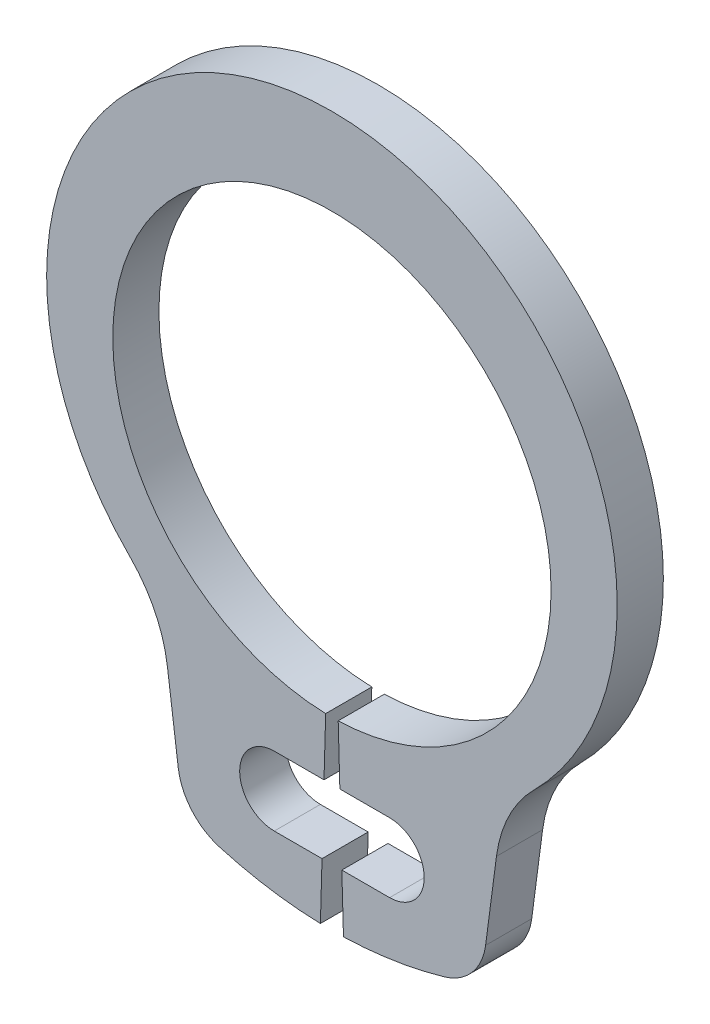
ISO-10303-21;
HEADER;
FILE_DESCRIPTION(('STEP AP214'),'2;1');
FILE_NAME('part.step','',(''),(''),'','','');
FILE_SCHEMA(('AUTOMOTIVE_DESIGN { 1 0 10303 214 1 1 1 1 }'));
ENDSEC;
DATA;
#1=APPLICATION_CONTEXT('core data for automotive mechanical design processes');
#2=APPLICATION_PROTOCOL_DEFINITION('international standard','automotive_design',2000,#1);
#3=PRODUCT_CONTEXT('',#1,'mechanical');
#4=PRODUCT('Part','Part','',(#3));
#5=PRODUCT_RELATED_PRODUCT_CATEGORY('part','',(#4));
#6=PRODUCT_DEFINITION_FORMATION('','',#4);
#7=PRODUCT_DEFINITION_CONTEXT('part definition',#1,'design');
#8=PRODUCT_DEFINITION('design','',#6,#7);
#9=PRODUCT_DEFINITION_SHAPE('','',#8);
#10=(LENGTH_UNIT() NAMED_UNIT(*) SI_UNIT(.MILLI.,.METRE.));
#11=(NAMED_UNIT(*) PLANE_ANGLE_UNIT() SI_UNIT($,.RADIAN.));
#12=(NAMED_UNIT(*) SI_UNIT($,.STERADIAN.) SOLID_ANGLE_UNIT());
#13=UNCERTAINTY_MEASURE_WITH_UNIT(LENGTH_MEASURE(1.E-05),#10,'distance_accuracy_value','');
#14=(GEOMETRIC_REPRESENTATION_CONTEXT(3) GLOBAL_UNCERTAINTY_ASSIGNED_CONTEXT((#13)) GLOBAL_UNIT_ASSIGNED_CONTEXT((#10,
#11,#12)) REPRESENTATION_CONTEXT('',''));
#15=CARTESIAN_POINT('',(0.,0.,0.));
#16=DIRECTION('',(0.,0.,1.));
#17=DIRECTION('',(1.,0.,0.));
#18=AXIS2_PLACEMENT_3D('',#15,#16,#17);
#19=CARTESIAN_POINT('',(-0.108571428571429,-3.7984486629278,-0.8));
#20=DIRECTION('',(0.999591753402051,-0.0285714285714286,0.));
#21=DIRECTION('',(0.0285714285714286,0.999591753402052,0.));
#22=AXIS2_PLACEMENT_3D('',#19,#20,#21);
#23=PLANE('',#22);
#24=DIRECTION('',(0.,0.,1.));
#25=VECTOR('',#24,1.);
#26=CARTESIAN_POINT('',(-0.13743687708596,-4.80832691319598,-0.8));
#27=LINE('',#26,#25);
#28=CARTESIAN_POINT('',(-0.13743687708596,-4.80832691319598,-0.8));
#29=VERTEX_POINT('',#28);
#30=CARTESIAN_POINT('',(-0.13743687708596,-4.80832691319598,0.));
#31=VERTEX_POINT('',#30);
#32=EDGE_CURVE('E205',#29,#31,#27,.T.);
#33=ORIENTED_EDGE('',*,*,#32,.F.);
#34=DIRECTION('',(0.0285714285714286,0.999591753402052,0.));
#35=VECTOR('',#34,1.);
#36=CARTESIAN_POINT('',(-0.108571428571429,-3.7984486629278,-0.8));
#37=LINE('',#36,#35);
#38=CARTESIAN_POINT('',(-0.108571428571429,-3.7984486629278,-0.8));
#39=VERTEX_POINT('',#38);
#40=EDGE_CURVE('E194',#29,#39,#37,.T.);
#41=ORIENTED_EDGE('',*,*,#40,.T.);
#42=DIRECTION('',(0.,0.,1.));
#43=VECTOR('',#42,1.);
#44=CARTESIAN_POINT('',(-0.108571428571429,-3.7984486629278,-0.8));
#45=LINE('',#44,#43);
#46=CARTESIAN_POINT('',(-0.108571428571429,-3.7984486629278,0.));
#47=VERTEX_POINT('',#46);
#48=EDGE_CURVE('E11',#39,#47,#45,.T.);
#49=ORIENTED_EDGE('',*,*,#48,.T.);
#50=DIRECTION('',(0.0285714285714286,0.999591753402052,0.));
#51=VECTOR('',#50,1.);
#52=CARTESIAN_POINT('',(-0.108571428571429,-3.7984486629278,0.));
#53=LINE('',#52,#51);
#54=EDGE_CURVE('E283',#31,#47,#53,.T.);
#55=ORIENTED_EDGE('',*,*,#54,.F.);
#56=EDGE_LOOP('',(#33,#41,#49,#55));
#57=FACE_BOUND('',#56,.T.);
#58=ADVANCED_FACE('F34',(#57),#23,.T.);
#59=CARTESIAN_POINT('',(0.108571428571429,-3.7984486629278,-0.8));
#60=DIRECTION('',(-0.999591753402051,-0.0285714285714286,0.));
#61=DIRECTION('',(0.0285714285714286,-0.999591753402052,0.));
#62=AXIS2_PLACEMENT_3D('',#59,#60,#61);
#63=PLANE('',#62);
#64=DIRECTION('',(0.,0.,-1.));
#65=VECTOR('',#64,1.);
#66=CARTESIAN_POINT('',(0.13743687708596,-4.80832691319598,-0.8));
#67=LINE('',#66,#65);
#68=CARTESIAN_POINT('',(0.13743687708596,-4.80832691319598,0.));
#69=VERTEX_POINT('',#68);
#70=CARTESIAN_POINT('',(0.13743687708596,-4.80832691319598,-0.8));
#71=VERTEX_POINT('',#70);
#72=EDGE_CURVE('E316',#69,#71,#67,.T.);
#73=ORIENTED_EDGE('',*,*,#72,.F.);
#74=DIRECTION('',(0.0285714285714286,-0.999591753402052,0.));
#75=VECTOR('',#74,1.);
#76=CARTESIAN_POINT('',(0.108571428571429,-3.7984486629278,0.));
#77=LINE('',#76,#75);
#78=CARTESIAN_POINT('',(0.108571428571429,-3.7984486629278,0.));
#79=VERTEX_POINT('',#78);
#80=EDGE_CURVE('E253',#79,#69,#77,.T.);
#81=ORIENTED_EDGE('',*,*,#80,.F.);
#82=DIRECTION('',(0.,0.,1.));
#83=VECTOR('',#82,1.);
#84=CARTESIAN_POINT('',(0.108571428571429,-3.7984486629278,-0.8));
#85=LINE('',#84,#83);
#86=CARTESIAN_POINT('',(0.108571428571429,-3.7984486629278,-0.8));
#87=VERTEX_POINT('',#86);
#88=EDGE_CURVE('E38',#87,#79,#85,.T.);
#89=ORIENTED_EDGE('',*,*,#88,.F.);
#90=DIRECTION('',(0.0285714285714286,-0.999591753402052,0.));
#91=VECTOR('',#90,1.);
#92=CARTESIAN_POINT('',(0.108571428571429,-3.7984486629278,-0.8));
#93=LINE('',#92,#91);
#94=EDGE_CURVE('E217',#87,#71,#93,.T.);
#95=ORIENTED_EDGE('',*,*,#94,.T.);
#96=EDGE_LOOP('',(#73,#81,#89,#95));
#97=FACE_BOUND('',#96,.T.);
#98=ADVANCED_FACE('F315',(#97),#63,.T.);
#99=CARTESIAN_POINT('',(0.,0.,-0.8));
#100=DIRECTION('',(0.,0.,1.));
#101=DIRECTION('',(1.,0.,0.));
#102=AXIS2_PLACEMENT_3D('',#99,#100,#101);
#103=CYLINDRICAL_SURFACE('',#102,3.8);
#104=CARTESIAN_POINT('',(0.,0.,0.));
#105=DIRECTION('',(0.,0.,-1.));
#106=DIRECTION('',(1.,0.,0.));
#107=AXIS2_PLACEMENT_3D('',#104,#105,#106);
#108=CIRCLE('',#107,3.8);
#109=EDGE_CURVE('E210',#47,#79,#108,.T.);
#110=ORIENTED_EDGE('',*,*,#109,.F.);
#111=ORIENTED_EDGE('',*,*,#48,.F.);
#112=CARTESIAN_POINT('',(0.,0.,-0.8));
#113=DIRECTION('',(0.,0.,-1.));
#114=DIRECTION('',(1.,0.,0.));
#115=AXIS2_PLACEMENT_3D('',#112,#113,#114);
#116=CIRCLE('',#115,3.8);
#117=EDGE_CURVE('E212',#39,#87,#116,.T.);
#118=ORIENTED_EDGE('',*,*,#117,.T.);
#119=ORIENTED_EDGE('',*,*,#88,.T.);
#120=EDGE_LOOP('',(#110,#111,#118,#119));
#121=FACE_BOUND('',#120,.T.);
#122=ADVANCED_FACE('F36',(#121),#103,.F.);
#123=DIRECTION('',(0.,0.,-1.));
#124=VECTOR('',#123,1.);
#125=CARTESIAN_POINT('',(-0.171736594114461,-6.00832691319598,-0.8));
#126=LINE('',#125,#124);
#127=CARTESIAN_POINT('',(-0.171736594114461,-6.00832691319598,0.));
#128=VERTEX_POINT('',#127);
#129=CARTESIAN_POINT('',(-0.171736594114461,-6.00832691319598,-0.8));
#130=VERTEX_POINT('',#129);
#131=EDGE_CURVE('E337',#128,#130,#126,.T.);
#132=ORIENTED_EDGE('',*,*,#131,.F.);
#133=CARTESIAN_POINT('',(-0.2,-6.99714227381436,0.));
#134=VERTEX_POINT('',#133);
#135=EDGE_CURVE('E216',#134,#128,#53,.T.);
#136=ORIENTED_EDGE('',*,*,#135,.F.);
#137=DIRECTION('',(0.,0.,1.));
#138=VECTOR('',#137,1.);
#139=CARTESIAN_POINT('',(-0.2,-6.99714227381436,-0.8));
#140=LINE('',#139,#138);
#141=CARTESIAN_POINT('',(-0.2,-6.99714227381436,-0.8));
#142=VERTEX_POINT('',#141);
#143=EDGE_CURVE('E43',#142,#134,#140,.T.);
#144=ORIENTED_EDGE('',*,*,#143,.F.);
#145=EDGE_CURVE('E247',#142,#130,#37,.T.);
#146=ORIENTED_EDGE('',*,*,#145,.T.);
#147=EDGE_LOOP('',(#132,#136,#144,#146));
#148=FACE_BOUND('',#147,.T.);
#149=ADVANCED_FACE('F385',(#148),#23,.T.);
#150=CARTESIAN_POINT('',(0.,0.,-0.8));
#151=DIRECTION('',(0.,0.,1.));
#152=DIRECTION('',(1.,0.,0.));
#153=AXIS2_PLACEMENT_3D('',#150,#151,#152);
#154=CYLINDRICAL_SURFACE('',#153,7.);
#155=CARTESIAN_POINT('',(0.,0.,0.));
#156=DIRECTION('',(0.,0.,1.));
#157=DIRECTION('',(1.,0.,0.));
#158=AXIS2_PLACEMENT_3D('',#155,#156,#157);
#159=CIRCLE('',#158,7.);
#160=CARTESIAN_POINT('',(-1.95199270347282,-6.72233028685655,0.));
#161=VERTEX_POINT('',#160);
#162=EDGE_CURVE('E280',#161,#134,#159,.T.);
#163=ORIENTED_EDGE('',*,*,#162,.F.);
#164=DIRECTION('',(0.,0.,1.));
#165=VECTOR('',#164,1.);
#166=CARTESIAN_POINT('',(-1.95199270347282,-6.72233028685655,-0.8));
#167=LINE('',#166,#165);
#168=CARTESIAN_POINT('',(-1.95199270347282,-6.72233028685655,-0.8));
#169=VERTEX_POINT('',#168);
#170=EDGE_CURVE('E287',#169,#161,#167,.T.);
#171=ORIENTED_EDGE('',*,*,#170,.F.);
#172=CARTESIAN_POINT('',(0.,0.,-0.8));
#173=DIRECTION('',(0.,0.,1.));
#174=DIRECTION('',(1.,0.,0.));
#175=AXIS2_PLACEMENT_3D('',#172,#173,#174);
#176=CIRCLE('',#175,7.);
#177=EDGE_CURVE('E244',#169,#142,#176,.T.);
#178=ORIENTED_EDGE('',*,*,#177,.T.);
#179=ORIENTED_EDGE('',*,*,#143,.T.);
#180=EDGE_LOOP('',(#163,#171,#178,#179));
#181=FACE_BOUND('',#180,.T.);
#182=ADVANCED_FACE('F381',(#181),#154,.T.);
#183=CARTESIAN_POINT('',(-1.6731366029767,-5.76199738873419,-0.8));
#184=DIRECTION('',(0.,0.,1.));
#185=DIRECTION('',(1.,0.,0.));
#186=AXIS2_PLACEMENT_3D('',#183,#184,#185);
#187=CYLINDRICAL_SURFACE('',#186,1.);
#188=CARTESIAN_POINT('',(-1.6731366029767,-5.76199738873419,0.));
#189=DIRECTION('',(0.,0.,1.));
#190=DIRECTION('',(1.,0.,0.));
#191=AXIS2_PLACEMENT_3D('',#188,#189,#190);
#192=CIRCLE('',#191,1.);
#193=CARTESIAN_POINT('',(-2.66458146435051,-5.89252358095424,0.));
#194=VERTEX_POINT('',#193);
#195=EDGE_CURVE('E277',#194,#161,#192,.T.);
#196=ORIENTED_EDGE('',*,*,#195,.F.);
#197=DIRECTION('',(0.,0.,1.));
#198=VECTOR('',#197,1.);
#199=CARTESIAN_POINT('',(-2.66458146435051,-5.89252358095424,-0.8));
#200=LINE('',#199,#198);
#201=CARTESIAN_POINT('',(-2.66458146435051,-5.89252358095424,-0.8));
#202=VERTEX_POINT('',#201);
#203=EDGE_CURVE('E289',#202,#194,#200,.T.);
#204=ORIENTED_EDGE('',*,*,#203,.F.);
#205=CARTESIAN_POINT('',(-1.6731366029767,-5.76199738873419,-0.8));
#206=DIRECTION('',(0.,0.,1.));
#207=DIRECTION('',(1.,0.,0.));
#208=AXIS2_PLACEMENT_3D('',#205,#206,#207);
#209=CIRCLE('',#208,1.);
#210=EDGE_CURVE('E241',#202,#169,#209,.T.);
#211=ORIENTED_EDGE('',*,*,#210,.T.);
#212=ORIENTED_EDGE('',*,*,#170,.T.);
#213=EDGE_LOOP('',(#196,#204,#211,#212));
#214=FACE_BOUND('',#213,.T.);
#215=ADVANCED_FACE('F377',(#214),#187,.T.);
#216=CARTESIAN_POINT('',(-2.85298125232632,-4.46148511660048,-0.8));
#217=DIRECTION('',(-0.99144486137381,-0.130526192220052,0.));
#218=DIRECTION('',(0.130526192220052,-0.991444861373811,0.));
#219=AXIS2_PLACEMENT_3D('',#216,#217,#218);
#220=PLANE('',#219);
#221=DIRECTION('',(0.130526192220052,-0.99144486137381,0.));
#222=VECTOR('',#221,1.);
#223=CARTESIAN_POINT('',(-2.85298125232632,-4.46148511660048,0.));
#224=LINE('',#223,#222);
#225=CARTESIAN_POINT('',(-2.85298125232632,-4.46148511660048,0.));
#226=VERTEX_POINT('',#225);
#227=EDGE_CURVE('E274',#226,#194,#224,.T.);
#228=ORIENTED_EDGE('',*,*,#227,.F.);
#229=DIRECTION('',(0.,0.,1.));
#230=VECTOR('',#229,1.);
#231=CARTESIAN_POINT('',(-2.85298125232632,-4.46148511660048,-0.8));
#232=LINE('',#231,#230);
#233=CARTESIAN_POINT('',(-2.85298125232632,-4.46148511660048,-0.8));
#234=VERTEX_POINT('',#233);
#235=EDGE_CURVE('E291',#234,#226,#232,.T.);
#236=ORIENTED_EDGE('',*,*,#235,.F.);
#237=DIRECTION('',(0.130526192220052,-0.99144486137381,0.));
#238=VECTOR('',#237,1.);
#239=CARTESIAN_POINT('',(-2.85298125232632,-4.46148511660048,-0.8));
#240=LINE('',#239,#238);
#241=EDGE_CURVE('E238',#234,#202,#240,.T.);
#242=ORIENTED_EDGE('',*,*,#241,.T.);
#243=ORIENTED_EDGE('',*,*,#203,.T.);
#244=EDGE_LOOP('',(#228,#236,#242,#243));
#245=FACE_BOUND('',#244,.T.);
#246=ADVANCED_FACE('F372',(#245),#220,.T.);
#247=CARTESIAN_POINT('',(-5.13117241134197,-4.76141467266642,-0.8));
#248=DIRECTION('',(0.,0.,1.));
#249=DIRECTION('',(1.,0.,0.));
#250=AXIS2_PLACEMENT_3D('',#247,#248,#249);
#251=CYLINDRICAL_SURFACE('',#250,2.29784958072085);
#252=CARTESIAN_POINT('',(-5.13117241134197,-4.76141467266642,0.));
#253=DIRECTION('',(0.,0.,-1.));
#254=DIRECTION('',(1.,0.,0.));
#255=AXIS2_PLACEMENT_3D('',#252,#253,#254);
#256=CIRCLE('',#255,2.29784958072085);
#257=CARTESIAN_POINT('',(-3.5037027583481,-3.13923859584769,0.));
#258=VERTEX_POINT('',#257);
#259=EDGE_CURVE('E271',#258,#226,#256,.T.);
#260=ORIENTED_EDGE('',*,*,#259,.F.);
#261=DIRECTION('',(0.,0.,1.));
#262=VECTOR('',#261,1.);
#263=CARTESIAN_POINT('',(-3.5037027583481,-3.13923859584769,-0.8));
#264=LINE('',#263,#262);
#265=CARTESIAN_POINT('',(-3.5037027583481,-3.13923859584769,-0.8));
#266=VERTEX_POINT('',#265);
#267=EDGE_CURVE('E293',#266,#258,#264,.T.);
#268=ORIENTED_EDGE('',*,*,#267,.F.);
#269=CARTESIAN_POINT('',(-5.13117241134197,-4.76141467266642,-0.8));
#270=DIRECTION('',(0.,0.,-1.));
#271=DIRECTION('',(1.,0.,0.));
#272=AXIS2_PLACEMENT_3D('',#269,#270,#271);
#273=CIRCLE('',#272,2.29784958072085);
#274=EDGE_CURVE('E235',#266,#234,#273,.T.);
#275=ORIENTED_EDGE('',*,*,#274,.T.);
#276=ORIENTED_EDGE('',*,*,#235,.T.);
#277=EDGE_LOOP('',(#260,#268,#275,#276));
#278=FACE_BOUND('',#277,.T.);
#279=ADVANCED_FACE('F368',(#278),#251,.F.);
#280=CARTESIAN_POINT('',(0.,0.35306787169261,-0.8));
#281=DIRECTION('',(0.,0.,1.));
#282=DIRECTION('',(1.,0.,0.));
#283=AXIS2_PLACEMENT_3D('',#280,#281,#282);
#284=CYLINDRICAL_SURFACE('',#283,4.94693212830739);
#285=CARTESIAN_POINT('',(0.,0.35306787169261,0.));
#286=DIRECTION('',(0.,0.,1.));
#287=DIRECTION('',(1.,0.,0.));
#288=AXIS2_PLACEMENT_3D('',#285,#286,#287);
#289=CIRCLE('',#288,4.94693212830739);
#290=CARTESIAN_POINT('',(3.5037027583481,-3.13923859584769,0.));
#291=VERTEX_POINT('',#290);
#292=EDGE_CURVE('E268',#291,#258,#289,.T.);
#293=ORIENTED_EDGE('',*,*,#292,.F.);
#294=DIRECTION('',(0.,0.,1.));
#295=VECTOR('',#294,1.);
#296=CARTESIAN_POINT('',(3.5037027583481,-3.13923859584769,-0.8));
#297=LINE('',#296,#295);
#298=CARTESIAN_POINT('',(3.5037027583481,-3.13923859584769,-0.8));
#299=VERTEX_POINT('',#298);
#300=EDGE_CURVE('E295',#299,#291,#297,.T.);
#301=ORIENTED_EDGE('',*,*,#300,.F.);
#302=CARTESIAN_POINT('',(0.,0.35306787169261,-0.8));
#303=DIRECTION('',(0.,0.,1.));
#304=DIRECTION('',(1.,0.,0.));
#305=AXIS2_PLACEMENT_3D('',#302,#303,#304);
#306=CIRCLE('',#305,4.94693212830739);
#307=EDGE_CURVE('E232',#299,#266,#306,.T.);
#308=ORIENTED_EDGE('',*,*,#307,.T.);
#309=ORIENTED_EDGE('',*,*,#267,.T.);
#310=EDGE_LOOP('',(#293,#301,#308,#309));
#311=FACE_BOUND('',#310,.T.);
#312=ADVANCED_FACE('F364',(#311),#284,.T.);
#313=CARTESIAN_POINT('',(5.13117241134197,-4.76141467266642,-0.8));
#314=DIRECTION('',(0.,0.,1.));
#315=DIRECTION('',(1.,0.,0.));
#316=AXIS2_PLACEMENT_3D('',#313,#314,#315);
#317=CYLINDRICAL_SURFACE('',#316,2.29784958072085);
#318=CARTESIAN_POINT('',(5.13117241134197,-4.76141467266642,0.));
#319=DIRECTION('',(0.,0.,-1.));
#320=DIRECTION('',(1.,0.,0.));
#321=AXIS2_PLACEMENT_3D('',#318,#319,#320);
#322=CIRCLE('',#321,2.29784958072085);
#323=CARTESIAN_POINT('',(2.85298125232632,-4.46148511660048,0.));
#324=VERTEX_POINT('',#323);
#325=EDGE_CURVE('E265',#324,#291,#322,.T.);
#326=ORIENTED_EDGE('',*,*,#325,.F.);
#327=DIRECTION('',(0.,0.,1.));
#328=VECTOR('',#327,1.);
#329=CARTESIAN_POINT('',(2.85298125232632,-4.46148511660048,-0.8));
#330=LINE('',#329,#328);
#331=CARTESIAN_POINT('',(2.85298125232632,-4.46148511660048,-0.8));
#332=VERTEX_POINT('',#331);
#333=EDGE_CURVE('E297',#332,#324,#330,.T.);
#334=ORIENTED_EDGE('',*,*,#333,.F.);
#335=CARTESIAN_POINT('',(5.13117241134197,-4.76141467266642,-0.8));
#336=DIRECTION('',(0.,0.,-1.));
#337=DIRECTION('',(1.,0.,0.));
#338=AXIS2_PLACEMENT_3D('',#335,#336,#337);
#339=CIRCLE('',#338,2.29784958072085);
#340=EDGE_CURVE('E229',#332,#299,#339,.T.);
#341=ORIENTED_EDGE('',*,*,#340,.T.);
#342=ORIENTED_EDGE('',*,*,#300,.T.);
#343=EDGE_LOOP('',(#326,#334,#341,#342));
#344=FACE_BOUND('',#343,.T.);
#345=ADVANCED_FACE('F360',(#344),#317,.F.);
#346=CARTESIAN_POINT('',(2.85298125232632,-4.46148511660048,-0.8));
#347=DIRECTION('',(0.99144486137381,-0.130526192220052,0.));
#348=DIRECTION('',(0.130526192220052,0.991444861373811,0.));
#349=AXIS2_PLACEMENT_3D('',#346,#347,#348);
#350=PLANE('',#349);
#351=DIRECTION('',(0.130526192220052,0.99144486137381,0.));
#352=VECTOR('',#351,1.);
#353=CARTESIAN_POINT('',(2.85298125232632,-4.46148511660048,0.));
#354=LINE('',#353,#352);
#355=CARTESIAN_POINT('',(2.66458146435051,-5.89252358095424,0.));
#356=VERTEX_POINT('',#355);
#357=EDGE_CURVE('E262',#356,#324,#354,.T.);
#358=ORIENTED_EDGE('',*,*,#357,.F.);
#359=DIRECTION('',(0.,0.,1.));
#360=VECTOR('',#359,1.);
#361=CARTESIAN_POINT('',(2.66458146435051,-5.89252358095424,-0.8));
#362=LINE('',#361,#360);
#363=CARTESIAN_POINT('',(2.66458146435051,-5.89252358095424,-0.8));
#364=VERTEX_POINT('',#363);
#365=EDGE_CURVE('E299',#364,#356,#362,.T.);
#366=ORIENTED_EDGE('',*,*,#365,.F.);
#367=DIRECTION('',(0.130526192220052,0.99144486137381,0.));
#368=VECTOR('',#367,1.);
#369=CARTESIAN_POINT('',(2.85298125232632,-4.46148511660048,-0.8));
#370=LINE('',#369,#368);
#371=EDGE_CURVE('E226',#364,#332,#370,.T.);
#372=ORIENTED_EDGE('',*,*,#371,.T.);
#373=ORIENTED_EDGE('',*,*,#333,.T.);
#374=EDGE_LOOP('',(#358,#366,#372,#373));
#375=FACE_BOUND('',#374,.T.);
#376=ADVANCED_FACE('F356',(#375),#350,.T.);
#377=CARTESIAN_POINT('',(1.6731366029767,-5.76199738873419,-0.8));
#378=DIRECTION('',(0.,0.,1.));
#379=DIRECTION('',(1.,0.,0.));
#380=AXIS2_PLACEMENT_3D('',#377,#378,#379);
#381=CYLINDRICAL_SURFACE('',#380,1.);
#382=CARTESIAN_POINT('',(1.6731366029767,-5.76199738873419,0.));
#383=DIRECTION('',(0.,0.,1.));
#384=DIRECTION('',(-1.,0.,0.));
#385=AXIS2_PLACEMENT_3D('',#382,#383,#384);
#386=CIRCLE('',#385,1.);
#387=CARTESIAN_POINT('',(1.95199270347282,-6.72233028685655,0.));
#388=VERTEX_POINT('',#387);
#389=EDGE_CURVE('E259',#388,#356,#386,.T.);
#390=ORIENTED_EDGE('',*,*,#389,.F.);
#391=DIRECTION('',(0.,0.,1.));
#392=VECTOR('',#391,1.);
#393=CARTESIAN_POINT('',(1.95199270347282,-6.72233028685655,-0.8));
#394=LINE('',#393,#392);
#395=CARTESIAN_POINT('',(1.95199270347282,-6.72233028685655,-0.8));
#396=VERTEX_POINT('',#395);
#397=EDGE_CURVE('E301',#396,#388,#394,.T.);
#398=ORIENTED_EDGE('',*,*,#397,.F.);
#399=CARTESIAN_POINT('',(1.6731366029767,-5.76199738873419,-0.8));
#400=DIRECTION('',(0.,0.,1.));
#401=DIRECTION('',(-1.,0.,0.));
#402=AXIS2_PLACEMENT_3D('',#399,#400,#401);
#403=CIRCLE('',#402,1.);
#404=EDGE_CURVE('E223',#396,#364,#403,.T.);
#405=ORIENTED_EDGE('',*,*,#404,.T.);
#406=ORIENTED_EDGE('',*,*,#365,.T.);
#407=EDGE_LOOP('',(#390,#398,#405,#406));
#408=FACE_BOUND('',#407,.T.);
#409=ADVANCED_FACE('F353',(#408),#381,.T.);
#410=CARTESIAN_POINT('',(0.,0.,-0.8));
#411=DIRECTION('',(0.,0.,1.));
#412=DIRECTION('',(1.,0.,0.));
#413=AXIS2_PLACEMENT_3D('',#410,#411,#412);
#414=CYLINDRICAL_SURFACE('',#413,7.);
#415=CARTESIAN_POINT('',(0.,0.,0.));
#416=DIRECTION('',(0.,0.,1.));
#417=DIRECTION('',(1.,0.,0.));
#418=AXIS2_PLACEMENT_3D('',#415,#416,#417);
#419=CIRCLE('',#418,7.);
#420=CARTESIAN_POINT('',(0.199999999999999,-6.99714227381436,0.));
#421=VERTEX_POINT('',#420);
#422=EDGE_CURVE('E256',#421,#388,#419,.T.);
#423=ORIENTED_EDGE('',*,*,#422,.F.);
#424=DIRECTION('',(0.,0.,1.));
#425=VECTOR('',#424,1.);
#426=CARTESIAN_POINT('',(0.199999999999999,-6.99714227381436,-0.8));
#427=LINE('',#426,#425);
#428=CARTESIAN_POINT('',(0.199999999999999,-6.99714227381436,-0.8));
#429=VERTEX_POINT('',#428);
#430=EDGE_CURVE('E302',#429,#421,#427,.T.);
#431=ORIENTED_EDGE('',*,*,#430,.F.);
#432=CARTESIAN_POINT('',(0.,0.,-0.8));
#433=DIRECTION('',(0.,0.,1.));
#434=DIRECTION('',(1.,0.,0.));
#435=AXIS2_PLACEMENT_3D('',#432,#433,#434);
#436=CIRCLE('',#435,7.);
#437=EDGE_CURVE('E220',#429,#396,#436,.T.);
#438=ORIENTED_EDGE('',*,*,#437,.T.);
#439=ORIENTED_EDGE('',*,*,#397,.T.);
#440=EDGE_LOOP('',(#423,#431,#438,#439));
#441=FACE_BOUND('',#440,.T.);
#442=ADVANCED_FACE('F349',(#441),#414,.T.);
#443=DIRECTION('',(0.,0.,1.));
#444=VECTOR('',#443,1.);
#445=CARTESIAN_POINT('',(0.171736594114461,-6.00832691319598,-0.8));
#446=LINE('',#445,#444);
#447=CARTESIAN_POINT('',(0.171736594114461,-6.00832691319598,-0.8));
#448=VERTEX_POINT('',#447);
#449=CARTESIAN_POINT('',(0.171736594114461,-6.00832691319598,0.));
#450=VERTEX_POINT('',#449);
#451=EDGE_CURVE('E332',#448,#450,#446,.T.);
#452=ORIENTED_EDGE('',*,*,#451,.F.);
#453=EDGE_CURVE('E215',#448,#429,#93,.T.);
#454=ORIENTED_EDGE('',*,*,#453,.T.);
#455=ORIENTED_EDGE('',*,*,#430,.T.);
#456=EDGE_CURVE('E252',#450,#421,#77,.T.);
#457=ORIENTED_EDGE('',*,*,#456,.F.);
#458=EDGE_LOOP('',(#452,#454,#455,#457));
#459=FACE_BOUND('',#458,.T.);
#460=ADVANCED_FACE('F347',(#459),#63,.T.);
#461=CARTESIAN_POINT('',(0.,0.,-0.8));
#462=DIRECTION('',(0.,0.,1.));
#463=DIRECTION('',(1.,0.,0.));
#464=AXIS2_PLACEMENT_3D('',#461,#462,#463);
#465=PLANE('',#464);
#466=CARTESIAN_POINT('',(1.,-5.40832691319598,-0.8));
#467=DIRECTION('',(0.,0.,1.));
#468=DIRECTION('',(1.,0.,0.));
#469=AXIS2_PLACEMENT_3D('',#466,#467,#468);
#470=CIRCLE('',#469,0.6);
#471=CARTESIAN_POINT('',(1.,-6.00832691319598,-0.8));
#472=VERTEX_POINT('',#471);
#473=CARTESIAN_POINT('',(1.,-4.80832691319598,-0.8));
#474=VERTEX_POINT('',#473);
#475=EDGE_CURVE('E203',#472,#474,#470,.T.);
#476=ORIENTED_EDGE('',*,*,#475,.T.);
#477=DIRECTION('',(-1.,0.,0.));
#478=VECTOR('',#477,1.);
#479=CARTESIAN_POINT('',(-1.,-4.80832691319598,-0.8));
#480=LINE('',#479,#478);
#481=EDGE_CURVE('E59',#474,#71,#480,.T.);
#482=ORIENTED_EDGE('',*,*,#481,.T.);
#483=ORIENTED_EDGE('',*,*,#94,.F.);
#484=ORIENTED_EDGE('',*,*,#117,.F.);
#485=ORIENTED_EDGE('',*,*,#40,.F.);
#486=CARTESIAN_POINT('',(-1.,-4.80832691319598,-0.8));
#487=VERTEX_POINT('',#486);
#488=EDGE_CURVE('E175',#29,#487,#480,.T.);
#489=ORIENTED_EDGE('',*,*,#488,.T.);
#490=CARTESIAN_POINT('',(-1.,-5.40832691319598,-0.8));
#491=DIRECTION('',(0.,0.,1.));
#492=DIRECTION('',(1.,0.,0.));
#493=AXIS2_PLACEMENT_3D('',#490,#491,#492);
#494=CIRCLE('',#493,0.6);
#495=CARTESIAN_POINT('',(-1.,-6.00832691319598,-0.8));
#496=VERTEX_POINT('',#495);
#497=EDGE_CURVE('E192',#487,#496,#494,.T.);
#498=ORIENTED_EDGE('',*,*,#497,.T.);
#499=DIRECTION('',(1.,0.,0.));
#500=VECTOR('',#499,1.);
#501=CARTESIAN_POINT('',(1.,-6.00832691319598,-0.8));
#502=LINE('',#501,#500);
#503=EDGE_CURVE('E184',#496,#130,#502,.T.);
#504=ORIENTED_EDGE('',*,*,#503,.T.);
#505=ORIENTED_EDGE('',*,*,#145,.F.);
#506=ORIENTED_EDGE('',*,*,#177,.F.);
#507=ORIENTED_EDGE('',*,*,#210,.F.);
#508=ORIENTED_EDGE('',*,*,#241,.F.);
#509=ORIENTED_EDGE('',*,*,#274,.F.);
#510=ORIENTED_EDGE('',*,*,#307,.F.);
#511=ORIENTED_EDGE('',*,*,#340,.F.);
#512=ORIENTED_EDGE('',*,*,#371,.F.);
#513=ORIENTED_EDGE('',*,*,#404,.F.);
#514=ORIENTED_EDGE('',*,*,#437,.F.);
#515=ORIENTED_EDGE('',*,*,#453,.F.);
#516=EDGE_CURVE('E324',#448,#472,#502,.T.);
#517=ORIENTED_EDGE('',*,*,#516,.T.);
#518=EDGE_LOOP('',(#476,#482,#483,#484,#485,#489,#498,#504,#505,#506,#507,#508,#509,#510,#511,
#512,#513,#514,#515,#517));
#519=FACE_BOUND('',#518,.T.);
#520=ADVANCED_FACE('F190',(#519),#465,.F.);
#521=CARTESIAN_POINT('',(0.,0.,0.));
#522=DIRECTION('',(0.,0.,1.));
#523=DIRECTION('',(1.,0.,0.));
#524=AXIS2_PLACEMENT_3D('',#521,#522,#523);
#525=PLANE('',#524);
#526=DIRECTION('',(-1.,0.,0.));
#527=VECTOR('',#526,1.);
#528=CARTESIAN_POINT('',(-1.,-4.80832691319598,0.));
#529=LINE('',#528,#527);
#530=CARTESIAN_POINT('',(1.,-4.80832691319598,0.));
#531=VERTEX_POINT('',#530);
#532=EDGE_CURVE('E327',#531,#69,#529,.T.);
#533=ORIENTED_EDGE('',*,*,#532,.F.);
#534=CARTESIAN_POINT('',(1.,-5.40832691319598,0.));
#535=DIRECTION('',(0.,0.,1.));
#536=DIRECTION('',(1.,0.,0.));
#537=AXIS2_PLACEMENT_3D('',#534,#535,#536);
#538=CIRCLE('',#537,0.6);
#539=CARTESIAN_POINT('',(1.,-6.00832691319598,0.));
#540=VERTEX_POINT('',#539);
#541=EDGE_CURVE('E199',#540,#531,#538,.T.);
#542=ORIENTED_EDGE('',*,*,#541,.F.);
#543=DIRECTION('',(1.,0.,0.));
#544=VECTOR('',#543,1.);
#545=CARTESIAN_POINT('',(1.,-6.00832691319598,0.));
#546=LINE('',#545,#544);
#547=EDGE_CURVE('E51',#450,#540,#546,.T.);
#548=ORIENTED_EDGE('',*,*,#547,.F.);
#549=ORIENTED_EDGE('',*,*,#456,.T.);
#550=ORIENTED_EDGE('',*,*,#422,.T.);
#551=ORIENTED_EDGE('',*,*,#389,.T.);
#552=ORIENTED_EDGE('',*,*,#357,.T.);
#553=ORIENTED_EDGE('',*,*,#325,.T.);
#554=ORIENTED_EDGE('',*,*,#292,.T.);
#555=ORIENTED_EDGE('',*,*,#259,.T.);
#556=ORIENTED_EDGE('',*,*,#227,.T.);
#557=ORIENTED_EDGE('',*,*,#195,.T.);
#558=ORIENTED_EDGE('',*,*,#162,.T.);
#559=ORIENTED_EDGE('',*,*,#135,.T.);
#560=CARTESIAN_POINT('',(-1.,-6.00832691319598,0.));
#561=VERTEX_POINT('',#560);
#562=EDGE_CURVE('E195',#561,#128,#546,.T.);
#563=ORIENTED_EDGE('',*,*,#562,.F.);
#564=CARTESIAN_POINT('',(-1.,-5.40832691319598,0.));
#565=DIRECTION('',(0.,0.,1.));
#566=DIRECTION('',(1.,0.,0.));
#567=AXIS2_PLACEMENT_3D('',#564,#565,#566);
#568=CIRCLE('',#567,0.6);
#569=CARTESIAN_POINT('',(-1.,-4.80832691319598,0.));
#570=VERTEX_POINT('',#569);
#571=EDGE_CURVE('E200',#570,#561,#568,.T.);
#572=ORIENTED_EDGE('',*,*,#571,.F.);
#573=EDGE_CURVE('E178',#31,#570,#529,.T.);
#574=ORIENTED_EDGE('',*,*,#573,.F.);
#575=ORIENTED_EDGE('',*,*,#54,.T.);
#576=ORIENTED_EDGE('',*,*,#109,.T.);
#577=ORIENTED_EDGE('',*,*,#80,.T.);
#578=EDGE_LOOP('',(#533,#542,#548,#549,#550,#551,#552,#553,#554,#555,#556,#557,#558,#559,#563,
#572,#574,#575,#576,#577));
#579=FACE_BOUND('',#578,.T.);
#580=ADVANCED_FACE('F319',(#579),#525,.T.);
#581=CARTESIAN_POINT('',(1.,-5.40832691319598,-0.8));
#582=DIRECTION('',(0.,0.,1.));
#583=DIRECTION('',(1.,0.,0.));
#584=AXIS2_PLACEMENT_3D('',#581,#582,#583);
#585=CYLINDRICAL_SURFACE('',#584,0.6);
#586=ORIENTED_EDGE('',*,*,#541,.T.);
#587=DIRECTION('',(0.,0.,1.));
#588=VECTOR('',#587,1.);
#589=CARTESIAN_POINT('',(1.,-4.80832691319598,-0.8));
#590=LINE('',#589,#588);
#591=EDGE_CURVE('E330',#474,#531,#590,.T.);
#592=ORIENTED_EDGE('',*,*,#591,.F.);
#593=ORIENTED_EDGE('',*,*,#475,.F.);
#594=DIRECTION('',(0.,0.,1.));
#595=VECTOR('',#594,1.);
#596=CARTESIAN_POINT('',(1.,-6.00832691319598,-0.8));
#597=LINE('',#596,#595);
#598=EDGE_CURVE('E333',#472,#540,#597,.T.);
#599=ORIENTED_EDGE('',*,*,#598,.T.);
#600=EDGE_LOOP('',(#586,#592,#593,#599));
#601=FACE_BOUND('',#600,.T.);
#602=ADVANCED_FACE('F341',(#601),#585,.F.);
#603=CARTESIAN_POINT('',(-1.,-5.40832691319598,-0.8));
#604=DIRECTION('',(0.,0.,1.));
#605=DIRECTION('',(1.,0.,0.));
#606=AXIS2_PLACEMENT_3D('',#603,#604,#605);
#607=CYLINDRICAL_SURFACE('',#606,0.6);
#608=ORIENTED_EDGE('',*,*,#571,.T.);
#609=DIRECTION('',(0.,0.,1.));
#610=VECTOR('',#609,1.);
#611=CARTESIAN_POINT('',(-1.,-6.00832691319598,-0.8));
#612=LINE('',#611,#610);
#613=EDGE_CURVE('E183',#496,#561,#612,.T.);
#614=ORIENTED_EDGE('',*,*,#613,.F.);
#615=ORIENTED_EDGE('',*,*,#497,.F.);
#616=DIRECTION('',(0.,0.,1.));
#617=VECTOR('',#616,1.);
#618=CARTESIAN_POINT('',(-1.,-4.80832691319598,-0.8));
#619=LINE('',#618,#617);
#620=EDGE_CURVE('E172',#487,#570,#619,.T.);
#621=ORIENTED_EDGE('',*,*,#620,.T.);
#622=EDGE_LOOP('',(#608,#614,#615,#621));
#623=FACE_BOUND('',#622,.T.);
#624=ADVANCED_FACE('F198',(#623),#607,.F.);
#625=CARTESIAN_POINT('',(-1.,-4.80832691319598,-0.8));
#626=DIRECTION('',(0.,1.,0.));
#627=DIRECTION('',(0.,0.,1.));
#628=AXIS2_PLACEMENT_3D('',#625,#626,#627);
#629=PLANE('',#628);
#630=ORIENTED_EDGE('',*,*,#32,.T.);
#631=ORIENTED_EDGE('',*,*,#573,.T.);
#632=ORIENTED_EDGE('',*,*,#620,.F.);
#633=ORIENTED_EDGE('',*,*,#488,.F.);
#634=EDGE_LOOP('',(#630,#631,#632,#633));
#635=FACE_BOUND('',#634,.T.);
#636=ADVANCED_FACE('F174',(#635),#629,.F.);
#637=CARTESIAN_POINT('',(1.,-6.00832691319598,-0.8));
#638=DIRECTION('',(0.,-1.,0.));
#639=DIRECTION('',(0.,0.,-1.));
#640=AXIS2_PLACEMENT_3D('',#637,#638,#639);
#641=PLANE('',#640);
#642=ORIENTED_EDGE('',*,*,#131,.T.);
#643=ORIENTED_EDGE('',*,*,#503,.F.);
#644=ORIENTED_EDGE('',*,*,#613,.T.);
#645=ORIENTED_EDGE('',*,*,#562,.T.);
#646=EDGE_LOOP('',(#642,#643,#644,#645));
#647=FACE_BOUND('',#646,.T.);
#648=ADVANCED_FACE('F388',(#647),#641,.F.);
#649=ORIENTED_EDGE('',*,*,#451,.T.);
#650=ORIENTED_EDGE('',*,*,#547,.T.);
#651=ORIENTED_EDGE('',*,*,#598,.F.);
#652=ORIENTED_EDGE('',*,*,#516,.F.);
#653=EDGE_LOOP('',(#649,#650,#651,#652));
#654=FACE_BOUND('',#653,.T.);
#655=ADVANCED_FACE('F342',(#654),#641,.F.);
#656=ORIENTED_EDGE('',*,*,#72,.T.);
#657=ORIENTED_EDGE('',*,*,#481,.F.);
#658=ORIENTED_EDGE('',*,*,#591,.T.);
#659=ORIENTED_EDGE('',*,*,#532,.T.);
#660=EDGE_LOOP('',(#656,#657,#658,#659));
#661=FACE_BOUND('',#660,.T.);
#662=ADVANCED_FACE('F338',(#661),#629,.F.);
#663=CLOSED_SHELL('',(#58,#98,#122,#149,#182,#215,#246,#279,#312,#345,#376,#409,#442,#460,#520,
#580,#602,#624,#636,#648,#655,#662));
#664=MANIFOLD_SOLID_BREP('B2',#663);
#665=ADVANCED_BREP_SHAPE_REPRESENTATION('',(#18,#664),#14);
#666=SHAPE_DEFINITION_REPRESENTATION(#9,#665);
ENDSEC;
END-ISO-10303-21;
